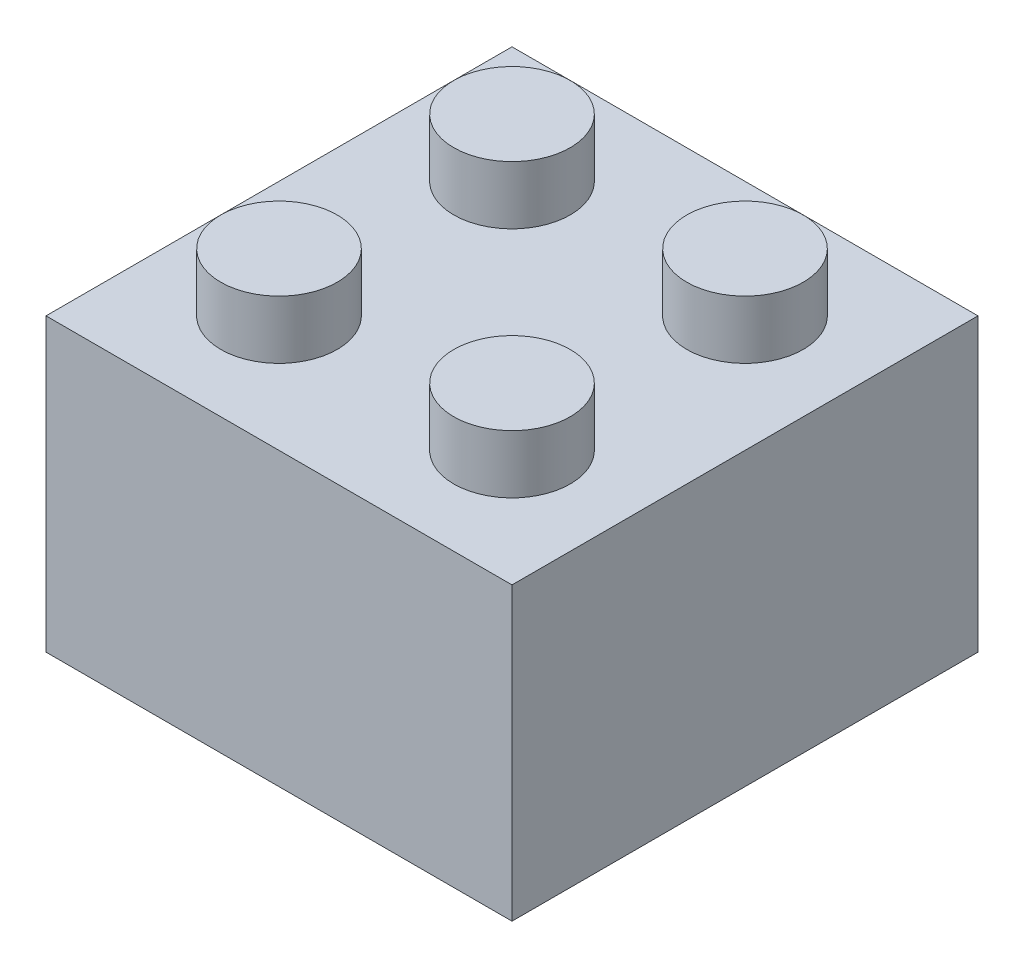
ISO-10303-21;
HEADER;
FILE_DESCRIPTION(('STEP AP214'),'2;1');
FILE_NAME('part.step','',(''),(''),'','','');
FILE_SCHEMA(('AUTOMOTIVE_DESIGN { 1 0 10303 214 1 1 1 1 }'));
ENDSEC;
DATA;
#1=APPLICATION_CONTEXT('core data for automotive mechanical design processes');
#2=APPLICATION_PROTOCOL_DEFINITION('international standard','automotive_design',2000,#1);
#3=PRODUCT_CONTEXT('',#1,'mechanical');
#4=PRODUCT('Part','Part','',(#3));
#5=PRODUCT_RELATED_PRODUCT_CATEGORY('part','',(#4));
#6=PRODUCT_DEFINITION_FORMATION('','',#4);
#7=PRODUCT_DEFINITION_CONTEXT('part definition',#1,'design');
#8=PRODUCT_DEFINITION('design','',#6,#7);
#9=PRODUCT_DEFINITION_SHAPE('','',#8);
#10=(LENGTH_UNIT() NAMED_UNIT(*) SI_UNIT(.MILLI.,.METRE.));
#11=(NAMED_UNIT(*) PLANE_ANGLE_UNIT() SI_UNIT($,.RADIAN.));
#12=(NAMED_UNIT(*) SI_UNIT($,.STERADIAN.) SOLID_ANGLE_UNIT());
#13=UNCERTAINTY_MEASURE_WITH_UNIT(LENGTH_MEASURE(1.E-05),#10,'distance_accuracy_value','');
#14=(GEOMETRIC_REPRESENTATION_CONTEXT(3) GLOBAL_UNCERTAINTY_ASSIGNED_CONTEXT((#13)) GLOBAL_UNIT_ASSIGNED_CONTEXT((#10,
#11,#12)) REPRESENTATION_CONTEXT('',''));
#15=CARTESIAN_POINT('',(0.,0.,0.));
#16=DIRECTION('',(0.,0.,1.));
#17=DIRECTION('',(1.,0.,0.));
#18=AXIS2_PLACEMENT_3D('',#15,#16,#17);
#19=CARTESIAN_POINT('',(8.,10.,-8.));
#20=DIRECTION('',(-1.,0.,0.));
#21=DIRECTION('',(0.,0.,1.));
#22=AXIS2_PLACEMENT_3D('',#19,#20,#21);
#23=PLANE('',#22);
#24=DIRECTION('',(0.,0.,-1.));
#25=VECTOR('',#24,1.);
#26=CARTESIAN_POINT('',(8.,0.,-8.));
#27=LINE('',#26,#25);
#28=CARTESIAN_POINT('',(8.,0.,8.));
#29=VERTEX_POINT('',#28);
#30=CARTESIAN_POINT('',(8.,0.,-8.));
#31=VERTEX_POINT('',#30);
#32=EDGE_CURVE('E229',#29,#31,#27,.T.);
#33=ORIENTED_EDGE('',*,*,#32,.T.);
#34=DIRECTION('',(0.,-1.,0.));
#35=VECTOR('',#34,1.);
#36=CARTESIAN_POINT('',(8.,10.,-8.));
#37=LINE('',#36,#35);
#38=CARTESIAN_POINT('',(8.,10.,-8.));
#39=VERTEX_POINT('',#38);
#40=EDGE_CURVE('E47',#39,#31,#37,.T.);
#41=ORIENTED_EDGE('',*,*,#40,.F.);
#42=DIRECTION('',(0.,0.,-1.));
#43=VECTOR('',#42,1.);
#44=CARTESIAN_POINT('',(8.,10.,-8.));
#45=LINE('',#44,#43);
#46=CARTESIAN_POINT('',(8.,10.,8.));
#47=VERTEX_POINT('',#46);
#48=EDGE_CURVE('E233',#47,#39,#45,.T.);
#49=ORIENTED_EDGE('',*,*,#48,.F.);
#50=DIRECTION('',(0.,-1.,0.));
#51=VECTOR('',#50,1.);
#52=CARTESIAN_POINT('',(8.,10.,8.));
#53=LINE('',#52,#51);
#54=EDGE_CURVE('E243',#47,#29,#53,.T.);
#55=ORIENTED_EDGE('',*,*,#54,.T.);
#56=EDGE_LOOP('',(#33,#41,#49,#55));
#57=FACE_BOUND('',#56,.T.);
#58=ADVANCED_FACE('F39',(#57),#23,.F.);
#59=CARTESIAN_POINT('',(-8.,10.,-8.));
#60=DIRECTION('',(0.,0.,1.));
#61=DIRECTION('',(1.,0.,0.));
#62=AXIS2_PLACEMENT_3D('',#59,#60,#61);
#63=PLANE('',#62);
#64=DIRECTION('',(-1.,0.,0.));
#65=VECTOR('',#64,1.);
#66=CARTESIAN_POINT('',(-8.,0.,-8.));
#67=LINE('',#66,#65);
#68=CARTESIAN_POINT('',(-8.,0.,-8.));
#69=VERTEX_POINT('',#68);
#70=EDGE_CURVE('E247',#31,#69,#67,.T.);
#71=ORIENTED_EDGE('',*,*,#70,.T.);
#72=DIRECTION('',(0.,-1.,0.));
#73=VECTOR('',#72,1.);
#74=CARTESIAN_POINT('',(-8.,10.,-8.));
#75=LINE('',#74,#73);
#76=CARTESIAN_POINT('',(-8.,10.,-8.));
#77=VERTEX_POINT('',#76);
#78=EDGE_CURVE('E260',#77,#69,#75,.T.);
#79=ORIENTED_EDGE('',*,*,#78,.F.);
#80=DIRECTION('',(-1.,0.,0.));
#81=VECTOR('',#80,1.);
#82=CARTESIAN_POINT('',(-8.,10.,-8.));
#83=LINE('',#82,#81);
#84=EDGE_CURVE('E92',#39,#77,#83,.T.);
#85=ORIENTED_EDGE('',*,*,#84,.F.);
#86=ORIENTED_EDGE('',*,*,#40,.T.);
#87=EDGE_LOOP('',(#71,#79,#85,#86));
#88=FACE_BOUND('',#87,.T.);
#89=ADVANCED_FACE('F265',(#88),#63,.F.);
#90=CARTESIAN_POINT('',(-8.,10.,-8.));
#91=DIRECTION('',(1.,0.,0.));
#92=DIRECTION('',(0.,0.,-1.));
#93=AXIS2_PLACEMENT_3D('',#90,#91,#92);
#94=PLANE('',#93);
#95=DIRECTION('',(0.,0.,1.));
#96=VECTOR('',#95,1.);
#97=CARTESIAN_POINT('',(-8.,0.,-8.));
#98=LINE('',#97,#96);
#99=CARTESIAN_POINT('',(-8.,0.,8.));
#100=VERTEX_POINT('',#99);
#101=EDGE_CURVE('E250',#69,#100,#98,.T.);
#102=ORIENTED_EDGE('',*,*,#101,.T.);
#103=DIRECTION('',(0.,-1.,0.));
#104=VECTOR('',#103,1.);
#105=CARTESIAN_POINT('',(-8.,10.,8.));
#106=LINE('',#105,#104);
#107=CARTESIAN_POINT('',(-8.,10.,8.));
#108=VERTEX_POINT('',#107);
#109=EDGE_CURVE('E257',#108,#100,#106,.T.);
#110=ORIENTED_EDGE('',*,*,#109,.F.);
#111=DIRECTION('',(0.,0.,1.));
#112=VECTOR('',#111,1.);
#113=CARTESIAN_POINT('',(-8.,10.,-8.));
#114=LINE('',#113,#112);
#115=EDGE_CURVE('E238',#77,#108,#114,.T.);
#116=ORIENTED_EDGE('',*,*,#115,.F.);
#117=ORIENTED_EDGE('',*,*,#78,.T.);
#118=EDGE_LOOP('',(#102,#110,#116,#117));
#119=FACE_BOUND('',#118,.T.);
#120=ADVANCED_FACE('F274',(#119),#94,.F.);
#121=CARTESIAN_POINT('',(-8.,10.,8.));
#122=DIRECTION('',(0.,0.,-1.));
#123=DIRECTION('',(-1.,0.,0.));
#124=AXIS2_PLACEMENT_3D('',#121,#122,#123);
#125=PLANE('',#124);
#126=DIRECTION('',(1.,0.,0.));
#127=VECTOR('',#126,1.);
#128=CARTESIAN_POINT('',(-8.,0.,8.));
#129=LINE('',#128,#127);
#130=EDGE_CURVE('E84',#100,#29,#129,.T.);
#131=ORIENTED_EDGE('',*,*,#130,.T.);
#132=ORIENTED_EDGE('',*,*,#54,.F.);
#133=DIRECTION('',(1.,0.,0.));
#134=VECTOR('',#133,1.);
#135=CARTESIAN_POINT('',(-8.,10.,8.));
#136=LINE('',#135,#134);
#137=EDGE_CURVE('E63',#108,#47,#136,.T.);
#138=ORIENTED_EDGE('',*,*,#137,.F.);
#139=ORIENTED_EDGE('',*,*,#109,.T.);
#140=EDGE_LOOP('',(#131,#132,#138,#139));
#141=FACE_BOUND('',#140,.T.);
#142=ADVANCED_FACE('F276',(#141),#125,.F.);
#143=CARTESIAN_POINT('',(0.,10.,0.));
#144=DIRECTION('',(0.,1.,0.));
#145=DIRECTION('',(0.,0.,1.));
#146=AXIS2_PLACEMENT_3D('',#143,#144,#145);
#147=PLANE('',#146);
#148=CARTESIAN_POINT('',(4.,10.,4.));
#149=DIRECTION('',(0.,1.,0.));
#150=DIRECTION('',(0.,0.,1.));
#151=AXIS2_PLACEMENT_3D('',#148,#149,#150);
#152=CIRCLE('',#151,2.);
#153=CARTESIAN_POINT('',(4.,10.,6.));
#154=VERTEX_POINT('',#153);
#155=EDGE_CURVE('E140',#154,#154,#152,.T.);
#156=ORIENTED_EDGE('',*,*,#155,.F.);
#157=EDGE_LOOP('',(#156));
#158=FACE_BOUND('',#157,.T.);
#159=CARTESIAN_POINT('',(-4.,10.,4.));
#160=DIRECTION('',(0.,1.,0.));
#161=DIRECTION('',(0.,0.,1.));
#162=AXIS2_PLACEMENT_3D('',#159,#160,#161);
#163=CIRCLE('',#162,2.);
#164=CARTESIAN_POINT('',(-4.,10.,6.));
#165=VERTEX_POINT('',#164);
#166=EDGE_CURVE('E207',#165,#165,#163,.T.);
#167=ORIENTED_EDGE('',*,*,#166,.F.);
#168=EDGE_LOOP('',(#167));
#169=FACE_BOUND('',#168,.T.);
#170=CARTESIAN_POINT('',(4.,10.,-4.));
#171=DIRECTION('',(0.,1.,0.));
#172=DIRECTION('',(0.,0.,1.));
#173=AXIS2_PLACEMENT_3D('',#170,#171,#172);
#174=CIRCLE('',#173,2.);
#175=CARTESIAN_POINT('',(4.,10.,-2.));
#176=VERTEX_POINT('',#175);
#177=EDGE_CURVE('E213',#176,#176,#174,.T.);
#178=ORIENTED_EDGE('',*,*,#177,.F.);
#179=EDGE_LOOP('',(#178));
#180=FACE_BOUND('',#179,.T.);
#181=CARTESIAN_POINT('',(-4.,10.,-4.));
#182=DIRECTION('',(0.,1.,0.));
#183=DIRECTION('',(0.,0.,1.));
#184=AXIS2_PLACEMENT_3D('',#181,#182,#183);
#185=CIRCLE('',#184,2.);
#186=CARTESIAN_POINT('',(-4.,10.,-2.));
#187=VERTEX_POINT('',#186);
#188=EDGE_CURVE('E221',#187,#187,#185,.T.);
#189=ORIENTED_EDGE('',*,*,#188,.F.);
#190=EDGE_LOOP('',(#189));
#191=FACE_BOUND('',#190,.T.);
#192=ORIENTED_EDGE('',*,*,#48,.T.);
#193=ORIENTED_EDGE('',*,*,#84,.T.);
#194=ORIENTED_EDGE('',*,*,#115,.T.);
#195=ORIENTED_EDGE('',*,*,#137,.T.);
#196=EDGE_LOOP('',(#192,#193,#194,#195));
#197=FACE_BOUND('',#196,.T.);
#198=ADVANCED_FACE('F277',(#158,#169,#180,#191,#197),#147,.T.);
#199=CARTESIAN_POINT('',(0.,0.,0.));
#200=DIRECTION('',(0.,1.,0.));
#201=DIRECTION('',(0.,0.,1.));
#202=AXIS2_PLACEMENT_3D('',#199,#200,#201);
#203=PLANE('',#202);
#204=DIRECTION('',(1.,0.,0.));
#205=VECTOR('',#204,1.);
#206=CARTESIAN_POINT('',(-8.,0.,7.));
#207=LINE('',#206,#205);
#208=CARTESIAN_POINT('',(-7.,0.,7.));
#209=VERTEX_POINT('',#208);
#210=CARTESIAN_POINT('',(7.,0.,7.));
#211=VERTEX_POINT('',#210);
#212=EDGE_CURVE('E134',#209,#211,#207,.T.);
#213=ORIENTED_EDGE('',*,*,#212,.T.);
#214=DIRECTION('',(0.,0.,-1.));
#215=VECTOR('',#214,1.);
#216=CARTESIAN_POINT('',(7.,0.,-8.));
#217=LINE('',#216,#215);
#218=CARTESIAN_POINT('',(7.,0.,-7.));
#219=VERTEX_POINT('',#218);
#220=EDGE_CURVE('E186',#211,#219,#217,.T.);
#221=ORIENTED_EDGE('',*,*,#220,.T.);
#222=DIRECTION('',(-1.,0.,0.));
#223=VECTOR('',#222,1.);
#224=CARTESIAN_POINT('',(-8.,0.,-7.));
#225=LINE('',#224,#223);
#226=CARTESIAN_POINT('',(-7.,0.,-7.));
#227=VERTEX_POINT('',#226);
#228=EDGE_CURVE('E138',#219,#227,#225,.T.);
#229=ORIENTED_EDGE('',*,*,#228,.T.);
#230=DIRECTION('',(0.,0.,1.));
#231=VECTOR('',#230,1.);
#232=CARTESIAN_POINT('',(-7.,0.,-8.));
#233=LINE('',#232,#231);
#234=EDGE_CURVE('E54',#227,#209,#233,.T.);
#235=ORIENTED_EDGE('',*,*,#234,.T.);
#236=EDGE_LOOP('',(#213,#221,#229,#235));
#237=FACE_BOUND('',#236,.T.);
#238=ORIENTED_EDGE('',*,*,#32,.F.);
#239=ORIENTED_EDGE('',*,*,#130,.F.);
#240=ORIENTED_EDGE('',*,*,#101,.F.);
#241=ORIENTED_EDGE('',*,*,#70,.F.);
#242=EDGE_LOOP('',(#238,#239,#240,#241));
#243=FACE_BOUND('',#242,.T.);
#244=ADVANCED_FACE('F270',(#237,#243),#203,.F.);
#245=CARTESIAN_POINT('',(-4.,12.,-4.));
#246=DIRECTION('',(0.,-1.,0.));
#247=DIRECTION('',(0.,0.,-1.));
#248=AXIS2_PLACEMENT_3D('',#245,#246,#247);
#249=CYLINDRICAL_SURFACE('',#248,2.);
#250=CARTESIAN_POINT('',(-4.,12.,-4.));
#251=DIRECTION('',(0.,1.,0.));
#252=DIRECTION('',(0.,0.,1.));
#253=AXIS2_PLACEMENT_3D('',#250,#251,#252);
#254=CIRCLE('',#253,2.);
#255=CARTESIAN_POINT('',(-4.,12.,-2.));
#256=VERTEX_POINT('',#255);
#257=EDGE_CURVE('E225',#256,#256,#254,.T.);
#258=ORIENTED_EDGE('',*,*,#257,.F.);
#259=EDGE_LOOP('',(#258));
#260=FACE_BOUND('',#259,.T.);
#261=ORIENTED_EDGE('',*,*,#188,.T.);
#262=EDGE_LOOP('',(#261));
#263=FACE_BOUND('',#262,.T.);
#264=ADVANCED_FACE('F285',(#260,#263),#249,.T.);
#265=CARTESIAN_POINT('',(-4.,12.,-4.));
#266=DIRECTION('',(0.,1.,0.));
#267=DIRECTION('',(0.,0.,1.));
#268=AXIS2_PLACEMENT_3D('',#265,#266,#267);
#269=PLANE('',#268);
#270=ORIENTED_EDGE('',*,*,#257,.T.);
#271=EDGE_LOOP('',(#270));
#272=FACE_BOUND('',#271,.T.);
#273=ADVANCED_FACE('F320',(#272),#269,.T.);
#274=CARTESIAN_POINT('',(4.,12.,-4.));
#275=DIRECTION('',(0.,-1.,0.));
#276=DIRECTION('',(0.,0.,-1.));
#277=AXIS2_PLACEMENT_3D('',#274,#275,#276);
#278=CYLINDRICAL_SURFACE('',#277,2.);
#279=CARTESIAN_POINT('',(4.,12.,-4.));
#280=DIRECTION('',(0.,1.,0.));
#281=DIRECTION('',(0.,0.,1.));
#282=AXIS2_PLACEMENT_3D('',#279,#280,#281);
#283=CIRCLE('',#282,2.);
#284=CARTESIAN_POINT('',(4.,12.,-2.));
#285=VERTEX_POINT('',#284);
#286=EDGE_CURVE('E217',#285,#285,#283,.T.);
#287=ORIENTED_EDGE('',*,*,#286,.F.);
#288=EDGE_LOOP('',(#287));
#289=FACE_BOUND('',#288,.T.);
#290=ORIENTED_EDGE('',*,*,#177,.T.);
#291=EDGE_LOOP('',(#290));
#292=FACE_BOUND('',#291,.T.);
#293=ADVANCED_FACE('F329',(#289,#292),#278,.T.);
#294=CARTESIAN_POINT('',(4.,12.,-4.));
#295=DIRECTION('',(0.,1.,0.));
#296=DIRECTION('',(0.,0.,1.));
#297=AXIS2_PLACEMENT_3D('',#294,#295,#296);
#298=PLANE('',#297);
#299=ORIENTED_EDGE('',*,*,#286,.T.);
#300=EDGE_LOOP('',(#299));
#301=FACE_BOUND('',#300,.T.);
#302=ADVANCED_FACE('F339',(#301),#298,.T.);
#303=CARTESIAN_POINT('',(-4.,12.,4.));
#304=DIRECTION('',(0.,-1.,0.));
#305=DIRECTION('',(0.,0.,-1.));
#306=AXIS2_PLACEMENT_3D('',#303,#304,#305);
#307=CYLINDRICAL_SURFACE('',#306,2.);
#308=CARTESIAN_POINT('',(-4.,12.,4.));
#309=DIRECTION('',(0.,1.,0.));
#310=DIRECTION('',(0.,0.,1.));
#311=AXIS2_PLACEMENT_3D('',#308,#309,#310);
#312=CIRCLE('',#311,2.);
#313=CARTESIAN_POINT('',(-4.,12.,6.));
#314=VERTEX_POINT('',#313);
#315=EDGE_CURVE('E209',#314,#314,#312,.T.);
#316=ORIENTED_EDGE('',*,*,#315,.F.);
#317=EDGE_LOOP('',(#316));
#318=FACE_BOUND('',#317,.T.);
#319=ORIENTED_EDGE('',*,*,#166,.T.);
#320=EDGE_LOOP('',(#319));
#321=FACE_BOUND('',#320,.T.);
#322=ADVANCED_FACE('F349',(#318,#321),#307,.T.);
#323=CARTESIAN_POINT('',(-4.,12.,4.));
#324=DIRECTION('',(0.,1.,0.));
#325=DIRECTION('',(0.,0.,1.));
#326=AXIS2_PLACEMENT_3D('',#323,#324,#325);
#327=PLANE('',#326);
#328=ORIENTED_EDGE('',*,*,#315,.T.);
#329=EDGE_LOOP('',(#328));
#330=FACE_BOUND('',#329,.T.);
#331=ADVANCED_FACE('F359',(#330),#327,.T.);
#332=CARTESIAN_POINT('',(4.,12.,4.));
#333=DIRECTION('',(0.,-1.,0.));
#334=DIRECTION('',(0.,0.,-1.));
#335=AXIS2_PLACEMENT_3D('',#332,#333,#334);
#336=CYLINDRICAL_SURFACE('',#335,2.);
#337=CARTESIAN_POINT('',(4.,12.,4.));
#338=DIRECTION('',(0.,1.,0.));
#339=DIRECTION('',(0.,0.,1.));
#340=AXIS2_PLACEMENT_3D('',#337,#338,#339);
#341=CIRCLE('',#340,2.);
#342=CARTESIAN_POINT('',(4.,12.,6.));
#343=VERTEX_POINT('',#342);
#344=EDGE_CURVE('E146',#343,#343,#341,.T.);
#345=ORIENTED_EDGE('',*,*,#344,.F.);
#346=EDGE_LOOP('',(#345));
#347=FACE_BOUND('',#346,.T.);
#348=ORIENTED_EDGE('',*,*,#155,.T.);
#349=EDGE_LOOP('',(#348));
#350=FACE_BOUND('',#349,.T.);
#351=ADVANCED_FACE('F369',(#347,#350),#336,.T.);
#352=CARTESIAN_POINT('',(4.,12.,4.));
#353=DIRECTION('',(0.,1.,0.));
#354=DIRECTION('',(0.,0.,1.));
#355=AXIS2_PLACEMENT_3D('',#352,#353,#354);
#356=PLANE('',#355);
#357=ORIENTED_EDGE('',*,*,#344,.T.);
#358=EDGE_LOOP('',(#357));
#359=FACE_BOUND('',#358,.T.);
#360=ADVANCED_FACE('F379',(#359),#356,.T.);
#361=CARTESIAN_POINT('',(7.,10.,-8.));
#362=DIRECTION('',(-1.,0.,0.));
#363=DIRECTION('',(0.,0.,1.));
#364=AXIS2_PLACEMENT_3D('',#361,#362,#363);
#365=PLANE('',#364);
#366=ORIENTED_EDGE('',*,*,#220,.F.);
#367=DIRECTION('',(0.,-1.,0.));
#368=VECTOR('',#367,1.);
#369=CARTESIAN_POINT('',(7.,10.,7.));
#370=LINE('',#369,#368);
#371=CARTESIAN_POINT('',(7.,9.,7.));
#372=VERTEX_POINT('',#371);
#373=EDGE_CURVE('E132',#372,#211,#370,.T.);
#374=ORIENTED_EDGE('',*,*,#373,.F.);
#375=DIRECTION('',(0.,0.,-1.));
#376=VECTOR('',#375,1.);
#377=CARTESIAN_POINT('',(7.,9.,-8.));
#378=LINE('',#377,#376);
#379=CARTESIAN_POINT('',(7.,9.,-7.));
#380=VERTEX_POINT('',#379);
#381=EDGE_CURVE('E119',#372,#380,#378,.T.);
#382=ORIENTED_EDGE('',*,*,#381,.T.);
#383=DIRECTION('',(0.,-1.,0.));
#384=VECTOR('',#383,1.);
#385=CARTESIAN_POINT('',(7.,10.,-7.));
#386=LINE('',#385,#384);
#387=EDGE_CURVE('E130',#380,#219,#386,.T.);
#388=ORIENTED_EDGE('',*,*,#387,.T.);
#389=EDGE_LOOP('',(#366,#374,#382,#388));
#390=FACE_BOUND('',#389,.T.);
#391=ADVANCED_FACE('F129',(#390),#365,.T.);
#392=CARTESIAN_POINT('',(-8.,10.,-7.));
#393=DIRECTION('',(0.,0.,1.));
#394=DIRECTION('',(1.,0.,0.));
#395=AXIS2_PLACEMENT_3D('',#392,#393,#394);
#396=PLANE('',#395);
#397=ORIENTED_EDGE('',*,*,#228,.F.);
#398=ORIENTED_EDGE('',*,*,#387,.F.);
#399=DIRECTION('',(-1.,0.,0.));
#400=VECTOR('',#399,1.);
#401=CARTESIAN_POINT('',(-8.,9.,-7.));
#402=LINE('',#401,#400);
#403=CARTESIAN_POINT('',(-7.,9.,-7.));
#404=VERTEX_POINT('',#403);
#405=EDGE_CURVE('E115',#380,#404,#402,.T.);
#406=ORIENTED_EDGE('',*,*,#405,.T.);
#407=DIRECTION('',(0.,-1.,0.));
#408=VECTOR('',#407,1.);
#409=CARTESIAN_POINT('',(-7.,10.,-7.));
#410=LINE('',#409,#408);
#411=EDGE_CURVE('E141',#404,#227,#410,.T.);
#412=ORIENTED_EDGE('',*,*,#411,.T.);
#413=EDGE_LOOP('',(#397,#398,#406,#412));
#414=FACE_BOUND('',#413,.T.);
#415=ADVANCED_FACE('F136',(#414),#396,.T.);
#416=CARTESIAN_POINT('',(-7.,10.,-8.));
#417=DIRECTION('',(1.,0.,0.));
#418=DIRECTION('',(0.,0.,-1.));
#419=AXIS2_PLACEMENT_3D('',#416,#417,#418);
#420=PLANE('',#419);
#421=ORIENTED_EDGE('',*,*,#234,.F.);
#422=ORIENTED_EDGE('',*,*,#411,.F.);
#423=DIRECTION('',(0.,0.,1.));
#424=VECTOR('',#423,1.);
#425=CARTESIAN_POINT('',(-7.,9.,-8.));
#426=LINE('',#425,#424);
#427=CARTESIAN_POINT('',(-7.,9.,7.));
#428=VERTEX_POINT('',#427);
#429=EDGE_CURVE('E120',#404,#428,#426,.T.);
#430=ORIENTED_EDGE('',*,*,#429,.T.);
#431=DIRECTION('',(0.,-1.,0.));
#432=VECTOR('',#431,1.);
#433=CARTESIAN_POINT('',(-7.,10.,7.));
#434=LINE('',#433,#432);
#435=EDGE_CURVE('E148',#428,#209,#434,.T.);
#436=ORIENTED_EDGE('',*,*,#435,.T.);
#437=EDGE_LOOP('',(#421,#422,#430,#436));
#438=FACE_BOUND('',#437,.T.);
#439=ADVANCED_FACE('F411',(#438),#420,.T.);
#440=CARTESIAN_POINT('',(-8.,10.,7.));
#441=DIRECTION('',(0.,0.,-1.));
#442=DIRECTION('',(-1.,0.,0.));
#443=AXIS2_PLACEMENT_3D('',#440,#441,#442);
#444=PLANE('',#443);
#445=ORIENTED_EDGE('',*,*,#212,.F.);
#446=ORIENTED_EDGE('',*,*,#435,.F.);
#447=DIRECTION('',(1.,0.,0.));
#448=VECTOR('',#447,1.);
#449=CARTESIAN_POINT('',(-8.,9.,7.));
#450=LINE('',#449,#448);
#451=EDGE_CURVE('E155',#428,#372,#450,.T.);
#452=ORIENTED_EDGE('',*,*,#451,.T.);
#453=ORIENTED_EDGE('',*,*,#373,.T.);
#454=EDGE_LOOP('',(#445,#446,#452,#453));
#455=FACE_BOUND('',#454,.T.);
#456=ADVANCED_FACE('F420',(#455),#444,.T.);
#457=CARTESIAN_POINT('',(0.,9.,0.));
#458=DIRECTION('',(0.,1.,0.));
#459=DIRECTION('',(0.,0.,1.));
#460=AXIS2_PLACEMENT_3D('',#457,#458,#459);
#461=PLANE('',#460);
#462=CARTESIAN_POINT('',(0.,9.,0.));
#463=DIRECTION('',(0.,1.,0.));
#464=DIRECTION('',(0.,0.,1.));
#465=AXIS2_PLACEMENT_3D('',#462,#463,#464);
#466=CIRCLE('',#465,2.7);
#467=CARTESIAN_POINT('',(0.,9.,2.7));
#468=VERTEX_POINT('',#467);
#469=EDGE_CURVE('E11',#468,#468,#466,.F.);
#470=ORIENTED_EDGE('',*,*,#469,.F.);
#471=EDGE_LOOP('',(#470));
#472=FACE_BOUND('',#471,.T.);
#473=CARTESIAN_POINT('',(4.,9.,4.));
#474=DIRECTION('',(0.,1.,0.));
#475=DIRECTION('',(0.,0.,1.));
#476=AXIS2_PLACEMENT_3D('',#473,#474,#475);
#477=CIRCLE('',#476,1.);
#478=CARTESIAN_POINT('',(4.,9.,5.));
#479=VERTEX_POINT('',#478);
#480=EDGE_CURVE('E163',#479,#479,#477,.T.);
#481=ORIENTED_EDGE('',*,*,#480,.T.);
#482=EDGE_LOOP('',(#481));
#483=FACE_BOUND('',#482,.T.);
#484=CARTESIAN_POINT('',(-4.,9.,4.));
#485=DIRECTION('',(0.,1.,0.));
#486=DIRECTION('',(0.,0.,1.));
#487=AXIS2_PLACEMENT_3D('',#484,#485,#486);
#488=CIRCLE('',#487,1.);
#489=CARTESIAN_POINT('',(-4.,9.,5.));
#490=VERTEX_POINT('',#489);
#491=EDGE_CURVE('E168',#490,#490,#488,.T.);
#492=ORIENTED_EDGE('',*,*,#491,.T.);
#493=EDGE_LOOP('',(#492));
#494=FACE_BOUND('',#493,.T.);
#495=CARTESIAN_POINT('',(4.,9.,-4.));
#496=DIRECTION('',(0.,1.,0.));
#497=DIRECTION('',(0.,0.,1.));
#498=AXIS2_PLACEMENT_3D('',#495,#496,#497);
#499=CIRCLE('',#498,1.);
#500=CARTESIAN_POINT('',(4.,9.,-3.));
#501=VERTEX_POINT('',#500);
#502=EDGE_CURVE('E173',#501,#501,#499,.T.);
#503=ORIENTED_EDGE('',*,*,#502,.T.);
#504=EDGE_LOOP('',(#503));
#505=FACE_BOUND('',#504,.T.);
#506=CARTESIAN_POINT('',(-4.,9.,-4.));
#507=DIRECTION('',(0.,1.,0.));
#508=DIRECTION('',(0.,0.,1.));
#509=AXIS2_PLACEMENT_3D('',#506,#507,#508);
#510=CIRCLE('',#509,1.);
#511=CARTESIAN_POINT('',(-4.,9.,-3.));
#512=VERTEX_POINT('',#511);
#513=EDGE_CURVE('E178',#512,#512,#510,.T.);
#514=ORIENTED_EDGE('',*,*,#513,.T.);
#515=EDGE_LOOP('',(#514));
#516=FACE_BOUND('',#515,.T.);
#517=ORIENTED_EDGE('',*,*,#381,.F.);
#518=ORIENTED_EDGE('',*,*,#451,.F.);
#519=ORIENTED_EDGE('',*,*,#429,.F.);
#520=ORIENTED_EDGE('',*,*,#405,.F.);
#521=EDGE_LOOP('',(#517,#518,#519,#520));
#522=FACE_BOUND('',#521,.T.);
#523=ADVANCED_FACE('F117',(#472,#483,#494,#505,#516,#522),#461,.F.);
#524=CARTESIAN_POINT('',(-4.,12.,-4.));
#525=DIRECTION('',(0.,-1.,0.));
#526=DIRECTION('',(0.,0.,-1.));
#527=AXIS2_PLACEMENT_3D('',#524,#525,#526);
#528=CYLINDRICAL_SURFACE('',#527,1.);
#529=CARTESIAN_POINT('',(-4.,11.,-4.));
#530=DIRECTION('',(0.,1.,0.));
#531=DIRECTION('',(0.,0.,1.));
#532=AXIS2_PLACEMENT_3D('',#529,#530,#531);
#533=CIRCLE('',#532,1.);
#534=CARTESIAN_POINT('',(-4.,11.,-3.));
#535=VERTEX_POINT('',#534);
#536=EDGE_CURVE('E182',#535,#535,#533,.T.);
#537=ORIENTED_EDGE('',*,*,#536,.T.);
#538=EDGE_LOOP('',(#537));
#539=FACE_BOUND('',#538,.T.);
#540=ORIENTED_EDGE('',*,*,#513,.F.);
#541=EDGE_LOOP('',(#540));
#542=FACE_BOUND('',#541,.T.);
#543=ADVANCED_FACE('F436',(#539,#542),#528,.F.);
#544=CARTESIAN_POINT('',(-4.,11.,-4.));
#545=DIRECTION('',(0.,1.,0.));
#546=DIRECTION('',(0.,0.,1.));
#547=AXIS2_PLACEMENT_3D('',#544,#545,#546);
#548=PLANE('',#547);
#549=ORIENTED_EDGE('',*,*,#536,.F.);
#550=EDGE_LOOP('',(#549));
#551=FACE_BOUND('',#550,.T.);
#552=ADVANCED_FACE('F441',(#551),#548,.F.);
#553=CARTESIAN_POINT('',(4.,12.,-4.));
#554=DIRECTION('',(0.,-1.,0.));
#555=DIRECTION('',(0.,0.,-1.));
#556=AXIS2_PLACEMENT_3D('',#553,#554,#555);
#557=CYLINDRICAL_SURFACE('',#556,1.);
#558=CARTESIAN_POINT('',(4.,11.,-4.));
#559=DIRECTION('',(0.,1.,0.));
#560=DIRECTION('',(0.,0.,1.));
#561=AXIS2_PLACEMENT_3D('',#558,#559,#560);
#562=CIRCLE('',#561,1.);
#563=CARTESIAN_POINT('',(4.,11.,-3.));
#564=VERTEX_POINT('',#563);
#565=EDGE_CURVE('E177',#564,#564,#562,.T.);
#566=ORIENTED_EDGE('',*,*,#565,.T.);
#567=EDGE_LOOP('',(#566));
#568=FACE_BOUND('',#567,.T.);
#569=ORIENTED_EDGE('',*,*,#502,.F.);
#570=EDGE_LOOP('',(#569));
#571=FACE_BOUND('',#570,.T.);
#572=ADVANCED_FACE('F451',(#568,#571),#557,.F.);
#573=CARTESIAN_POINT('',(4.,11.,-4.));
#574=DIRECTION('',(0.,1.,0.));
#575=DIRECTION('',(0.,0.,1.));
#576=AXIS2_PLACEMENT_3D('',#573,#574,#575);
#577=PLANE('',#576);
#578=ORIENTED_EDGE('',*,*,#565,.F.);
#579=EDGE_LOOP('',(#578));
#580=FACE_BOUND('',#579,.T.);
#581=ADVANCED_FACE('F461',(#580),#577,.F.);
#582=CARTESIAN_POINT('',(-4.,12.,4.));
#583=DIRECTION('',(0.,-1.,0.));
#584=DIRECTION('',(0.,0.,-1.));
#585=AXIS2_PLACEMENT_3D('',#582,#583,#584);
#586=CYLINDRICAL_SURFACE('',#585,1.);
#587=CARTESIAN_POINT('',(-4.,11.,4.));
#588=DIRECTION('',(0.,1.,0.));
#589=DIRECTION('',(0.,0.,1.));
#590=AXIS2_PLACEMENT_3D('',#587,#588,#589);
#591=CIRCLE('',#590,1.);
#592=CARTESIAN_POINT('',(-4.,11.,5.));
#593=VERTEX_POINT('',#592);
#594=EDGE_CURVE('E172',#593,#593,#591,.T.);
#595=ORIENTED_EDGE('',*,*,#594,.T.);
#596=EDGE_LOOP('',(#595));
#597=FACE_BOUND('',#596,.T.);
#598=ORIENTED_EDGE('',*,*,#491,.F.);
#599=EDGE_LOOP('',(#598));
#600=FACE_BOUND('',#599,.T.);
#601=ADVANCED_FACE('F471',(#597,#600),#586,.F.);
#602=CARTESIAN_POINT('',(-4.,11.,4.));
#603=DIRECTION('',(0.,1.,0.));
#604=DIRECTION('',(0.,0.,1.));
#605=AXIS2_PLACEMENT_3D('',#602,#603,#604);
#606=PLANE('',#605);
#607=ORIENTED_EDGE('',*,*,#594,.F.);
#608=EDGE_LOOP('',(#607));
#609=FACE_BOUND('',#608,.T.);
#610=ADVANCED_FACE('F481',(#609),#606,.F.);
#611=CARTESIAN_POINT('',(4.,12.,4.));
#612=DIRECTION('',(0.,-1.,0.));
#613=DIRECTION('',(0.,0.,-1.));
#614=AXIS2_PLACEMENT_3D('',#611,#612,#613);
#615=CYLINDRICAL_SURFACE('',#614,1.);
#616=CARTESIAN_POINT('',(4.,11.,4.));
#617=DIRECTION('',(0.,1.,0.));
#618=DIRECTION('',(0.,0.,1.));
#619=AXIS2_PLACEMENT_3D('',#616,#617,#618);
#620=CIRCLE('',#619,1.);
#621=CARTESIAN_POINT('',(4.,11.,5.));
#622=VERTEX_POINT('',#621);
#623=EDGE_CURVE('E167',#622,#622,#620,.T.);
#624=ORIENTED_EDGE('',*,*,#623,.T.);
#625=EDGE_LOOP('',(#624));
#626=FACE_BOUND('',#625,.T.);
#627=ORIENTED_EDGE('',*,*,#480,.F.);
#628=EDGE_LOOP('',(#627));
#629=FACE_BOUND('',#628,.T.);
#630=ADVANCED_FACE('F491',(#626,#629),#615,.F.);
#631=CARTESIAN_POINT('',(4.,11.,4.));
#632=DIRECTION('',(0.,1.,0.));
#633=DIRECTION('',(0.,0.,1.));
#634=AXIS2_PLACEMENT_3D('',#631,#632,#633);
#635=PLANE('',#634);
#636=ORIENTED_EDGE('',*,*,#623,.F.);
#637=EDGE_LOOP('',(#636));
#638=FACE_BOUND('',#637,.T.);
#639=ADVANCED_FACE('F501',(#638),#635,.F.);
#640=CARTESIAN_POINT('',(0.,0.,0.));
#641=DIRECTION('',(0.,-1.,0.));
#642=DIRECTION('',(0.,0.,-1.));
#643=AXIS2_PLACEMENT_3D('',#640,#641,#642);
#644=PLANE('',#643);
#645=CARTESIAN_POINT('',(0.,0.,0.));
#646=DIRECTION('',(0.,-1.,0.));
#647=DIRECTION('',(0.,0.,-1.));
#648=AXIS2_PLACEMENT_3D('',#645,#646,#647);
#649=CIRCLE('',#648,2.7);
#650=CARTESIAN_POINT('',(0.,0.,-2.7));
#651=VERTEX_POINT('',#650);
#652=EDGE_CURVE('E151',#651,#651,#649,.T.);
#653=ORIENTED_EDGE('',*,*,#652,.T.);
#654=EDGE_LOOP('',(#653));
#655=FACE_BOUND('',#654,.T.);
#656=CARTESIAN_POINT('',(0.,0.,0.));
#657=DIRECTION('',(0.,-1.,0.));
#658=DIRECTION('',(0.,0.,-1.));
#659=AXIS2_PLACEMENT_3D('',#656,#657,#658);
#660=CIRCLE('',#659,1.7);
#661=CARTESIAN_POINT('',(0.,0.,-1.7));
#662=VERTEX_POINT('',#661);
#663=EDGE_CURVE('E566',#662,#662,#660,.T.);
#664=ORIENTED_EDGE('',*,*,#663,.F.);
#665=EDGE_LOOP('',(#664));
#666=FACE_BOUND('',#665,.T.);
#667=ADVANCED_FACE('F511',(#655,#666),#644,.T.);
#668=CARTESIAN_POINT('',(0.,0.,0.));
#669=DIRECTION('',(0.,1.,0.));
#670=DIRECTION('',(0.,0.,1.));
#671=AXIS2_PLACEMENT_3D('',#668,#669,#670);
#672=CYLINDRICAL_SURFACE('',#671,2.7);
#673=ORIENTED_EDGE('',*,*,#652,.F.);
#674=EDGE_LOOP('',(#673));
#675=FACE_BOUND('',#674,.T.);
#676=ORIENTED_EDGE('',*,*,#469,.T.);
#677=EDGE_LOOP('',(#676));
#678=FACE_BOUND('',#677,.T.);
#679=ADVANCED_FACE('F530',(#675,#678),#672,.T.);
#680=CARTESIAN_POINT('',(0.,0.,0.));
#681=DIRECTION('',(0.,1.,0.));
#682=DIRECTION('',(0.,0.,1.));
#683=AXIS2_PLACEMENT_3D('',#680,#681,#682);
#684=CYLINDRICAL_SURFACE('',#683,1.7);
#685=ORIENTED_EDGE('',*,*,#663,.T.);
#686=EDGE_LOOP('',(#685));
#687=FACE_BOUND('',#686,.T.);
#688=CARTESIAN_POINT('',(0.,9.,0.));
#689=DIRECTION('',(0.,-1.,0.));
#690=DIRECTION('',(0.,0.,-1.));
#691=AXIS2_PLACEMENT_3D('',#688,#689,#690);
#692=CIRCLE('',#691,1.7);
#693=CARTESIAN_POINT('',(0.,9.,-1.7));
#694=VERTEX_POINT('',#693);
#695=EDGE_CURVE('E563',#694,#694,#692,.T.);
#696=ORIENTED_EDGE('',*,*,#695,.F.);
#697=EDGE_LOOP('',(#696));
#698=FACE_BOUND('',#697,.T.);
#699=ADVANCED_FACE('F540',(#687,#698),#684,.F.);
#700=ORIENTED_EDGE('',*,*,#695,.T.);
#701=EDGE_LOOP('',(#700));
#702=FACE_BOUND('',#701,.T.);
#703=ADVANCED_FACE('F523',(#702),#461,.F.);
#704=CLOSED_SHELL('',(#58,#89,#120,#142,#198,#244,#264,#273,#293,#302,#322,#331,#351,#360,#391,
#415,#439,#456,#523,#543,#552,#572,#581,#601,#610,#630,#639,#667,#679,#699,#703));
#705=MANIFOLD_SOLID_BREP('B2',#704);
#706=ADVANCED_BREP_SHAPE_REPRESENTATION('',(#18,#705),#14);
#707=SHAPE_DEFINITION_REPRESENTATION(#9,#706);
ENDSEC;
END-ISO-10303-21;
